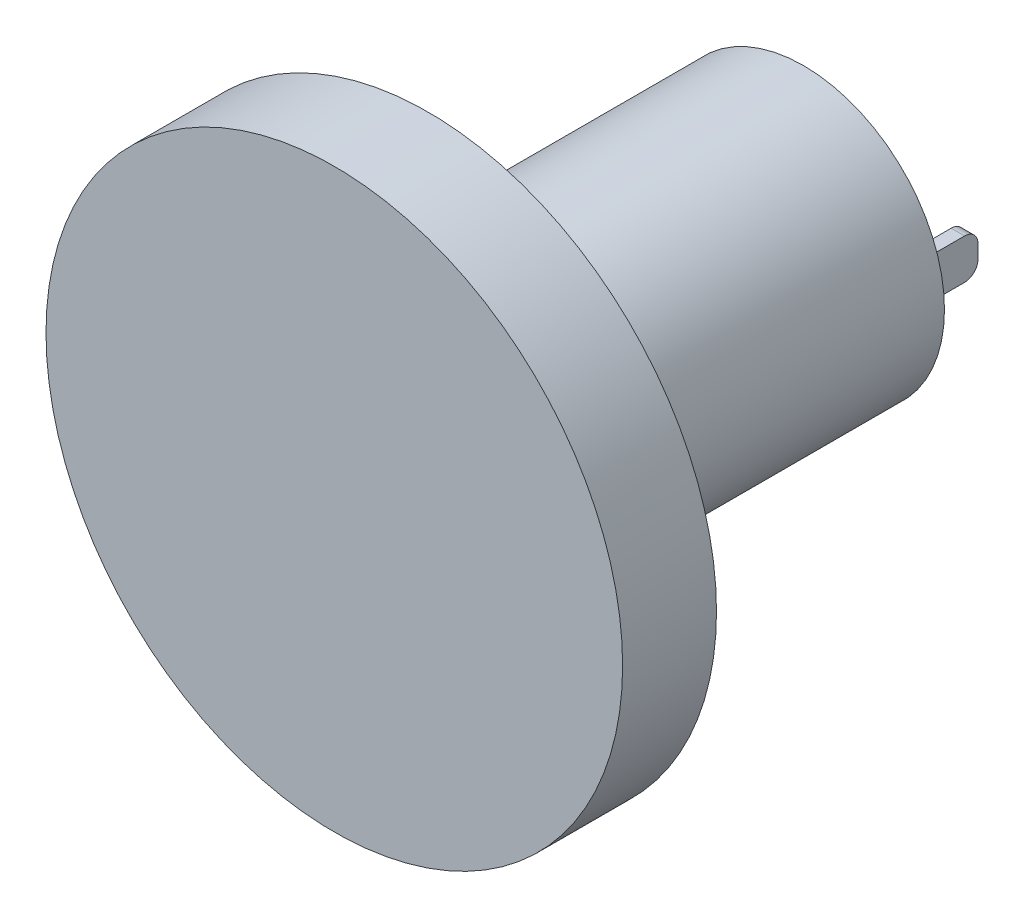
ISO-10303-21;
HEADER;
FILE_DESCRIPTION(('STEP AP214'),'2;1');
FILE_NAME('part.step','',(''),(''),'','','');
FILE_SCHEMA(('AUTOMOTIVE_DESIGN { 1 0 10303 214 1 1 1 1 }'));
ENDSEC;
DATA;
#1=APPLICATION_CONTEXT('core data for automotive mechanical design processes');
#2=APPLICATION_PROTOCOL_DEFINITION('international standard','automotive_design',2000,#1);
#3=PRODUCT_CONTEXT('',#1,'mechanical');
#4=PRODUCT('Part','Part','',(#3));
#5=PRODUCT_RELATED_PRODUCT_CATEGORY('part','',(#4));
#6=PRODUCT_DEFINITION_FORMATION('','',#4);
#7=PRODUCT_DEFINITION_CONTEXT('part definition',#1,'design');
#8=PRODUCT_DEFINITION('design','',#6,#7);
#9=PRODUCT_DEFINITION_SHAPE('','',#8);
#10=(LENGTH_UNIT() NAMED_UNIT(*) SI_UNIT(.MILLI.,.METRE.));
#11=(NAMED_UNIT(*) PLANE_ANGLE_UNIT() SI_UNIT($,.RADIAN.));
#12=(NAMED_UNIT(*) SI_UNIT($,.STERADIAN.) SOLID_ANGLE_UNIT());
#13=UNCERTAINTY_MEASURE_WITH_UNIT(LENGTH_MEASURE(1.E-05),#10,'distance_accuracy_value','');
#14=(GEOMETRIC_REPRESENTATION_CONTEXT(3) GLOBAL_UNCERTAINTY_ASSIGNED_CONTEXT((#13)) GLOBAL_UNIT_ASSIGNED_CONTEXT((#10,
#11,#12)) REPRESENTATION_CONTEXT('',''));
#15=CARTESIAN_POINT('',(0.,0.,0.));
#16=DIRECTION('',(0.,0.,1.));
#17=DIRECTION('',(1.,0.,0.));
#18=AXIS2_PLACEMENT_3D('',#15,#16,#17);
#19=CARTESIAN_POINT('',(-10.7845123488429,4.35461318675267,35.));
#20=DIRECTION('',(0.,0.,-1.));
#21=DIRECTION('',(-1.,0.,0.));
#22=AXIS2_PLACEMENT_3D('',#19,#20,#21);
#23=CYLINDRICAL_SURFACE('',#22,1.);
#24=CARTESIAN_POINT('',(-10.7845123488429,4.35461318675267,27.));
#25=DIRECTION('',(0.,0.,1.));
#26=DIRECTION('',(1.,0.,0.));
#27=AXIS2_PLACEMENT_3D('',#24,#25,#26);
#28=CIRCLE('',#27,1.);
#29=CARTESIAN_POINT('',(-9.78451234884289,4.35461318675267,27.));
#30=VERTEX_POINT('',#29);
#31=EDGE_CURVE('E208',#30,#30,#28,.T.);
#32=ORIENTED_EDGE('',*,*,#31,.T.);
#33=EDGE_LOOP('',(#32));
#34=FACE_BOUND('',#33,.T.);
#35=CARTESIAN_POINT('',(-10.7845123488429,4.35461318675267,28.));
#36=DIRECTION('',(0.,0.,1.));
#37=DIRECTION('',(1.,0.,0.));
#38=AXIS2_PLACEMENT_3D('',#35,#36,#37);
#39=CIRCLE('',#38,1.);
#40=CARTESIAN_POINT('',(-9.78451234884289,4.35461318675267,28.));
#41=VERTEX_POINT('',#40);
#42=EDGE_CURVE('E12',#41,#41,#39,.T.);
#43=ORIENTED_EDGE('',*,*,#42,.F.);
#44=EDGE_LOOP('',(#43));
#45=FACE_BOUND('',#44,.T.);
#46=ADVANCED_FACE('F35',(#34,#45),#23,.T.);
#47=CARTESIAN_POINT('',(-10.7845123488429,4.35461318675267,0.));
#48=DIRECTION('',(0.,0.,1.));
#49=DIRECTION('',(1.,0.,0.));
#50=AXIS2_PLACEMENT_3D('',#47,#48,#49);
#51=PLANE('',#50);
#52=DIRECTION('',(0.,1.,0.));
#53=VECTOR('',#52,1.);
#54=CARTESIAN_POINT('',(-3.78451234884289,5.85461318675267,0.));
#55=LINE('',#54,#53);
#56=CARTESIAN_POINT('',(-3.78451234884289,2.85461318675267,0.));
#57=VERTEX_POINT('',#56);
#58=CARTESIAN_POINT('',(-3.78451234884289,5.85461318675267,0.));
#59=VERTEX_POINT('',#58);
#60=EDGE_CURVE('E152',#57,#59,#55,.T.);
#61=ORIENTED_EDGE('',*,*,#60,.F.);
#62=DIRECTION('',(-1.,0.,0.));
#63=VECTOR('',#62,1.);
#64=CARTESIAN_POINT('',(-3.78451234884289,2.85461318675267,0.));
#65=LINE('',#64,#63);
#66=CARTESIAN_POINT('',(-2.78451234884289,2.85461318675267,0.));
#67=VERTEX_POINT('',#66);
#68=EDGE_CURVE('E164',#67,#57,#65,.T.);
#69=ORIENTED_EDGE('',*,*,#68,.F.);
#70=DIRECTION('',(0.,-1.,0.));
#71=VECTOR('',#70,1.);
#72=CARTESIAN_POINT('',(-2.78451234884289,5.85461318675267,0.));
#73=LINE('',#72,#71);
#74=CARTESIAN_POINT('',(-2.78451234884289,5.85461318675267,0.));
#75=VERTEX_POINT('',#74);
#76=EDGE_CURVE('E170',#75,#67,#73,.T.);
#77=ORIENTED_EDGE('',*,*,#76,.F.);
#78=DIRECTION('',(1.,0.,0.));
#79=VECTOR('',#78,1.);
#80=CARTESIAN_POINT('',(-3.78451234884289,5.85461318675267,0.));
#81=LINE('',#80,#79);
#82=EDGE_CURVE('E155',#59,#75,#81,.T.);
#83=ORIENTED_EDGE('',*,*,#82,.F.);
#84=EDGE_LOOP('',(#61,#69,#77,#83));
#85=FACE_BOUND('',#84,.T.);
#86=CARTESIAN_POINT('',(-10.7845123488429,4.35461318675267,0.));
#87=DIRECTION('',(0.,0.,1.));
#88=DIRECTION('',(1.,0.,0.));
#89=AXIS2_PLACEMENT_3D('',#86,#87,#88);
#90=CIRCLE('',#89,10.5);
#91=CARTESIAN_POINT('',(-21.2845123488429,4.35461318675267,0.));
#92=VERTEX_POINT('',#91);
#93=EDGE_CURVE('E221',#92,#92,#90,.T.);
#94=ORIENTED_EDGE('',*,*,#93,.F.);
#95=EDGE_LOOP('',(#94));
#96=FACE_BOUND('',#95,.T.);
#97=DIRECTION('',(0.,-1.,0.));
#98=VECTOR('',#97,1.);
#99=CARTESIAN_POINT('',(-17.7845123488429,2.85461318675267,0.));
#100=LINE('',#99,#98);
#101=CARTESIAN_POINT('',(-17.7845123488429,5.85461318675267,0.));
#102=VERTEX_POINT('',#101);
#103=CARTESIAN_POINT('',(-17.7845123488429,2.85461318675267,0.));
#104=VERTEX_POINT('',#103);
#105=EDGE_CURVE('E182',#102,#104,#100,.T.);
#106=ORIENTED_EDGE('',*,*,#105,.F.);
#107=DIRECTION('',(1.,0.,0.));
#108=VECTOR('',#107,1.);
#109=CARTESIAN_POINT('',(-17.7845123488429,5.85461318675267,0.));
#110=LINE('',#109,#108);
#111=CARTESIAN_POINT('',(-18.7845123488429,5.85461318675267,0.));
#112=VERTEX_POINT('',#111);
#113=EDGE_CURVE('E187',#112,#102,#110,.T.);
#114=ORIENTED_EDGE('',*,*,#113,.F.);
#115=DIRECTION('',(0.,1.,0.));
#116=VECTOR('',#115,1.);
#117=CARTESIAN_POINT('',(-18.7845123488429,2.85461318675267,0.));
#118=LINE('',#117,#116);
#119=CARTESIAN_POINT('',(-18.7845123488429,2.85461318675267,0.));
#120=VERTEX_POINT('',#119);
#121=EDGE_CURVE('E196',#120,#112,#118,.T.);
#122=ORIENTED_EDGE('',*,*,#121,.F.);
#123=DIRECTION('',(-1.,0.,0.));
#124=VECTOR('',#123,1.);
#125=CARTESIAN_POINT('',(-17.7845123488429,2.85461318675267,0.));
#126=LINE('',#125,#124);
#127=EDGE_CURVE('E193',#104,#120,#126,.T.);
#128=ORIENTED_EDGE('',*,*,#127,.F.);
#129=EDGE_LOOP('',(#106,#114,#122,#128));
#130=FACE_BOUND('',#129,.T.);
#131=CARTESIAN_POINT('',(-10.7845123488429,4.35461318675267,0.));
#132=DIRECTION('',(0.,0.,-1.));
#133=DIRECTION('',(-1.,0.,0.));
#134=AXIS2_PLACEMENT_3D('',#131,#132,#133);
#135=CIRCLE('',#134,3.);
#136=CARTESIAN_POINT('',(-8.78451234884289,6.59068116425246,0.));
#137=VERTEX_POINT('',#136);
#138=CARTESIAN_POINT('',(-12.7845123488429,6.59068116425246,0.));
#139=VERTEX_POINT('',#138);
#140=EDGE_CURVE('E151',#137,#139,#135,.T.);
#141=ORIENTED_EDGE('',*,*,#140,.F.);
#142=DIRECTION('',(1.,0.,0.));
#143=VECTOR('',#142,1.);
#144=CARTESIAN_POINT('',(-8.78451234884289,6.59068116425246,0.));
#145=LINE('',#144,#143);
#146=EDGE_CURVE('E49',#139,#137,#145,.T.);
#147=ORIENTED_EDGE('',*,*,#146,.F.);
#148=EDGE_LOOP('',(#141,#147));
#149=FACE_BOUND('',#148,.T.);
#150=ADVANCED_FACE('F288',(#85,#96,#130,#149),#51,.F.);
#151=CARTESIAN_POINT('',(-10.7845123488429,4.35461318675267,21.));
#152=DIRECTION('',(0.,0.,-1.));
#153=DIRECTION('',(-1.,0.,0.));
#154=AXIS2_PLACEMENT_3D('',#151,#152,#153);
#155=CYLINDRICAL_SURFACE('',#154,10.5);
#156=CARTESIAN_POINT('',(-10.7845123488429,4.35461318675267,21.));
#157=DIRECTION('',(0.,0.,1.));
#158=DIRECTION('',(1.,0.,0.));
#159=AXIS2_PLACEMENT_3D('',#156,#157,#158);
#160=CIRCLE('',#159,10.5);
#161=CARTESIAN_POINT('',(-21.2845123488429,4.35461318675267,21.));
#162=VERTEX_POINT('',#161);
#163=EDGE_CURVE('E224',#162,#162,#160,.T.);
#164=CARTESIAN_POINT('',(-21.2845123488429,4.35461318675267,21.));
#165=CARTESIAN_POINT('',(-21.2845123488429,4.35461318675267,20.78125));
#166=CARTESIAN_POINT('',(-21.2845123488429,4.35461318675267,20.5625));
#167=CARTESIAN_POINT('',(-21.2845123488429,4.35461318675267,20.125));
#168=CARTESIAN_POINT('',(-21.2845123488429,4.35461318675267,19.90625));
#169=CARTESIAN_POINT('',(-21.2845123488429,4.35461318675267,19.46875));
#170=CARTESIAN_POINT('',(-21.2845123488429,4.35461318675267,19.25));
#171=CARTESIAN_POINT('',(-21.2845123488429,4.35461318675267,18.8125));
#172=CARTESIAN_POINT('',(-21.2845123488429,4.35461318675267,18.59375));
#173=CARTESIAN_POINT('',(-21.2845123488429,4.35461318675267,18.15625));
#174=CARTESIAN_POINT('',(-21.2845123488429,4.35461318675267,17.9375));
#175=CARTESIAN_POINT('',(-21.2845123488429,4.35461318675267,17.5));
#176=CARTESIAN_POINT('',(-21.2845123488429,4.35461318675267,17.28125));
#177=CARTESIAN_POINT('',(-21.2845123488429,4.35461318675267,16.84375));
#178=CARTESIAN_POINT('',(-21.2845123488429,4.35461318675267,16.625));
#179=CARTESIAN_POINT('',(-21.2845123488429,4.35461318675267,16.1875));
#180=CARTESIAN_POINT('',(-21.2845123488429,4.35461318675267,15.96875));
#181=CARTESIAN_POINT('',(-21.2845123488429,4.35461318675267,15.53125));
#182=CARTESIAN_POINT('',(-21.2845123488429,4.35461318675267,15.3125));
#183=CARTESIAN_POINT('',(-21.2845123488429,4.35461318675267,14.875));
#184=CARTESIAN_POINT('',(-21.2845123488429,4.35461318675267,14.65625));
#185=CARTESIAN_POINT('',(-21.2845123488429,4.35461318675267,14.21875));
#186=CARTESIAN_POINT('',(-21.2845123488429,4.35461318675267,14.));
#187=CARTESIAN_POINT('',(-21.2845123488429,4.35461318675267,13.5625));
#188=CARTESIAN_POINT('',(-21.2845123488429,4.35461318675267,13.34375));
#189=CARTESIAN_POINT('',(-21.2845123488429,4.35461318675267,12.90625));
#190=CARTESIAN_POINT('',(-21.2845123488429,4.35461318675267,12.6875));
#191=CARTESIAN_POINT('',(-21.2845123488429,4.35461318675267,12.25));
#192=CARTESIAN_POINT('',(-21.2845123488429,4.35461318675267,12.03125));
#193=CARTESIAN_POINT('',(-21.2845123488429,4.35461318675267,11.59375));
#194=CARTESIAN_POINT('',(-21.2845123488429,4.35461318675267,11.375));
#195=CARTESIAN_POINT('',(-21.2845123488429,4.35461318675267,10.9375));
#196=CARTESIAN_POINT('',(-21.2845123488429,4.35461318675267,10.71875));
#197=CARTESIAN_POINT('',(-21.2845123488429,4.35461318675267,10.28125));
#198=CARTESIAN_POINT('',(-21.2845123488429,4.35461318675267,10.0625));
#199=CARTESIAN_POINT('',(-21.2845123488429,4.35461318675267,9.625));
#200=CARTESIAN_POINT('',(-21.2845123488429,4.35461318675267,9.40625));
#201=CARTESIAN_POINT('',(-21.2845123488429,4.35461318675267,8.96875));
#202=CARTESIAN_POINT('',(-21.2845123488429,4.35461318675267,8.75));
#203=CARTESIAN_POINT('',(-21.2845123488429,4.35461318675267,8.3125));
#204=CARTESIAN_POINT('',(-21.2845123488429,4.35461318675267,8.09375));
#205=CARTESIAN_POINT('',(-21.2845123488429,4.35461318675267,7.65625));
#206=CARTESIAN_POINT('',(-21.2845123488429,4.35461318675267,7.4375));
#207=CARTESIAN_POINT('',(-21.2845123488429,4.35461318675267,7.));
#208=CARTESIAN_POINT('',(-21.2845123488429,4.35461318675267,6.78125));
#209=CARTESIAN_POINT('',(-21.2845123488429,4.35461318675267,6.34375));
#210=CARTESIAN_POINT('',(-21.2845123488429,4.35461318675267,6.125));
#211=CARTESIAN_POINT('',(-21.2845123488429,4.35461318675267,5.6875));
#212=CARTESIAN_POINT('',(-21.2845123488429,4.35461318675267,5.46875));
#213=CARTESIAN_POINT('',(-21.2845123488429,4.35461318675267,5.03125));
#214=CARTESIAN_POINT('',(-21.2845123488429,4.35461318675267,4.8125));
#215=CARTESIAN_POINT('',(-21.2845123488429,4.35461318675267,4.375));
#216=CARTESIAN_POINT('',(-21.2845123488429,4.35461318675267,4.15625));
#217=CARTESIAN_POINT('',(-21.2845123488429,4.35461318675267,3.71875));
#218=CARTESIAN_POINT('',(-21.2845123488429,4.35461318675267,3.5));
#219=CARTESIAN_POINT('',(-21.2845123488429,4.35461318675267,3.0625));
#220=CARTESIAN_POINT('',(-21.2845123488429,4.35461318675267,2.84375));
#221=CARTESIAN_POINT('',(-21.2845123488429,4.35461318675267,2.40625));
#222=CARTESIAN_POINT('',(-21.2845123488429,4.35461318675267,2.1875));
#223=CARTESIAN_POINT('',(-21.2845123488429,4.35461318675267,1.75));
#224=CARTESIAN_POINT('',(-21.2845123488429,4.35461318675267,1.53125));
#225=CARTESIAN_POINT('',(-21.2845123488429,4.35461318675267,1.09375));
#226=CARTESIAN_POINT('',(-21.2845123488429,4.35461318675267,0.875000000000001));
#227=CARTESIAN_POINT('',(-21.2845123488429,4.35461318675267,0.4375));
#228=CARTESIAN_POINT('',(-21.2845123488429,4.35461318675267,0.21875));
#229=CARTESIAN_POINT('',(-21.2845123488429,4.35461318675267,0.));
#230=B_SPLINE_CURVE_WITH_KNOTS('',3,(#164,#165,#166,#167,#168,#169,#170,#171,#172,#173,#174,
#175,#176,#177,#178,#179,#180,#181,#182,#183,#184,#185,#186,#187,#188,#189,#190,#191,#192,#193,
#194,#195,#196,#197,#198,#199,#200,#201,#202,#203,#204,#205,#206,#207,#208,#209,#210,#211,#212,
#213,#214,#215,#216,#217,#218,#219,#220,#221,#222,#223,#224,#225,#226,#227,#228,#229),
.UNSPECIFIED.,.F.,.F.,(4,2,2,2,2,2,2,2,2,2,2,2,2,2,2,2,2,2,2,2,2,2,2,2,2,2,2,2,2,2,2,2,4),(0.,
0.656250000000001,1.3125,1.96875,2.625,3.28125,3.9375,4.59375,5.25,5.90625,6.5625,7.21875,7.875,
8.53125,9.1875,9.84375,10.5,11.15625,11.8125,12.46875,13.125,13.78125,14.4375,15.09375,15.75,
16.40625,17.0625,17.71875,18.375,19.03125,19.6875,20.34375,21.),.UNSPECIFIED.);
#231=EDGE_CURVE('BSEAM291',#162,#92,#230,.T.);
#232=ORIENTED_EDGE('',*,*,#163,.F.);
#233=ORIENTED_EDGE('',*,*,#93,.T.);
#234=ORIENTED_EDGE('',*,*,#231,.T.);
#235=ORIENTED_EDGE('',*,*,#231,.F.);
#236=EDGE_LOOP('',(#232,#234,#233,#235));
#237=FACE_BOUND('',#236,.T.);
#238=ADVANCED_FACE('F291',(#237),#155,.T.);
#239=CARTESIAN_POINT('',(-10.7845123488429,4.35461318675267,21.));
#240=DIRECTION('',(0.,0.,1.));
#241=DIRECTION('',(1.,0.,0.));
#242=AXIS2_PLACEMENT_3D('',#239,#240,#241);
#243=PLANE('',#242);
#244=CARTESIAN_POINT('',(-10.7845123488429,4.35461318675267,21.));
#245=DIRECTION('',(0.,0.,1.));
#246=DIRECTION('',(1.,0.,0.));
#247=AXIS2_PLACEMENT_3D('',#244,#245,#246);
#248=CIRCLE('',#247,8.5);
#249=CARTESIAN_POINT('',(-2.28451234884289,4.35461318675267,21.));
#250=VERTEX_POINT('',#249);
#251=EDGE_CURVE('E215',#250,#250,#248,.T.);
#252=ORIENTED_EDGE('',*,*,#251,.F.);
#253=EDGE_LOOP('',(#252));
#254=FACE_BOUND('',#253,.T.);
#255=ORIENTED_EDGE('',*,*,#163,.T.);
#256=EDGE_LOOP('',(#255));
#257=FACE_BOUND('',#256,.T.);
#258=ADVANCED_FACE('F355',(#254,#257),#243,.T.);
#259=CARTESIAN_POINT('',(-10.7845123488429,4.35461318675267,25.));
#260=DIRECTION('',(0.,0.,-1.));
#261=DIRECTION('',(-1.,0.,0.));
#262=AXIS2_PLACEMENT_3D('',#259,#260,#261);
#263=CYLINDRICAL_SURFACE('',#262,8.5);
#264=CARTESIAN_POINT('',(-10.7845123488429,4.35461318675267,25.));
#265=DIRECTION('',(0.,0.,1.));
#266=DIRECTION('',(1.,0.,0.));
#267=AXIS2_PLACEMENT_3D('',#264,#265,#266);
#268=CIRCLE('',#267,8.5);
#269=CARTESIAN_POINT('',(-2.28451234884289,4.35461318675267,25.));
#270=VERTEX_POINT('',#269);
#271=EDGE_CURVE('E218',#270,#270,#268,.T.);
#272=ORIENTED_EDGE('',*,*,#271,.F.);
#273=EDGE_LOOP('',(#272));
#274=FACE_BOUND('',#273,.T.);
#275=ORIENTED_EDGE('',*,*,#251,.T.);
#276=EDGE_LOOP('',(#275));
#277=FACE_BOUND('',#276,.T.);
#278=ADVANCED_FACE('F351',(#274,#277),#263,.T.);
#279=CARTESIAN_POINT('',(-10.7845123488429,4.35461318675267,25.));
#280=DIRECTION('',(0.,0.,1.));
#281=DIRECTION('',(1.,0.,0.));
#282=AXIS2_PLACEMENT_3D('',#279,#280,#281);
#283=PLANE('',#282);
#284=CARTESIAN_POINT('',(-10.7845123488429,4.35461318675267,25.));
#285=DIRECTION('',(0.,0.,1.));
#286=DIRECTION('',(1.,0.,0.));
#287=AXIS2_PLACEMENT_3D('',#284,#285,#286);
#288=CIRCLE('',#287,3.);
#289=CARTESIAN_POINT('',(-7.78451234884289,4.35461318675267,25.));
#290=VERTEX_POINT('',#289);
#291=EDGE_CURVE('E211',#290,#290,#288,.T.);
#292=ORIENTED_EDGE('',*,*,#291,.F.);
#293=EDGE_LOOP('',(#292));
#294=FACE_BOUND('',#293,.T.);
#295=ORIENTED_EDGE('',*,*,#271,.T.);
#296=EDGE_LOOP('',(#295));
#297=FACE_BOUND('',#296,.T.);
#298=ADVANCED_FACE('F347',(#294,#297),#283,.T.);
#299=CARTESIAN_POINT('',(-10.7845123488429,4.35461318675267,27.));
#300=DIRECTION('',(0.,0.,-1.));
#301=DIRECTION('',(-1.,0.,0.));
#302=AXIS2_PLACEMENT_3D('',#299,#300,#301);
#303=CYLINDRICAL_SURFACE('',#302,3.);
#304=CARTESIAN_POINT('',(-10.7845123488429,4.35461318675267,27.));
#305=DIRECTION('',(0.,0.,1.));
#306=DIRECTION('',(1.,0.,0.));
#307=AXIS2_PLACEMENT_3D('',#304,#305,#306);
#308=CIRCLE('',#307,3.);
#309=CARTESIAN_POINT('',(-7.78451234884289,4.35461318675267,27.));
#310=VERTEX_POINT('',#309);
#311=EDGE_CURVE('E212',#310,#310,#308,.T.);
#312=ORIENTED_EDGE('',*,*,#311,.F.);
#313=EDGE_LOOP('',(#312));
#314=FACE_BOUND('',#313,.T.);
#315=ORIENTED_EDGE('',*,*,#291,.T.);
#316=EDGE_LOOP('',(#315));
#317=FACE_BOUND('',#316,.T.);
#318=ADVANCED_FACE('F343',(#314,#317),#303,.T.);
#319=CARTESIAN_POINT('',(-10.7845123488429,4.35461318675267,27.));
#320=DIRECTION('',(0.,0.,1.));
#321=DIRECTION('',(1.,0.,0.));
#322=AXIS2_PLACEMENT_3D('',#319,#320,#321);
#323=PLANE('',#322);
#324=ORIENTED_EDGE('',*,*,#31,.F.);
#325=EDGE_LOOP('',(#324));
#326=FACE_BOUND('',#325,.T.);
#327=ORIENTED_EDGE('',*,*,#311,.T.);
#328=EDGE_LOOP('',(#327));
#329=FACE_BOUND('',#328,.T.);
#330=ADVANCED_FACE('F339',(#326,#329),#323,.T.);
#331=CARTESIAN_POINT('',(-17.7845123488429,2.85461318675267,-5.));
#332=DIRECTION('',(-1.,0.,0.));
#333=DIRECTION('',(0.,0.,1.));
#334=AXIS2_PLACEMENT_3D('',#331,#332,#333);
#335=PLANE('',#334);
#336=DIRECTION('',(0.,0.,1.));
#337=VECTOR('',#336,1.);
#338=CARTESIAN_POINT('',(-17.7845123488429,2.85461318675267,-5.));
#339=LINE('',#338,#337);
#340=CARTESIAN_POINT('',(-17.7845123488429,2.85461318675267,-4.));
#341=VERTEX_POINT('',#340);
#342=EDGE_CURVE('E206',#341,#104,#339,.T.);
#343=ORIENTED_EDGE('',*,*,#342,.F.);
#344=CARTESIAN_POINT('',(-17.7845123488429,3.85461318675267,-4.));
#345=DIRECTION('',(-1.,0.,0.));
#346=DIRECTION('',(0.,0.,1.));
#347=AXIS2_PLACEMENT_3D('',#344,#345,#346);
#348=CIRCLE('',#347,1.);
#349=CARTESIAN_POINT('',(-17.7845123488429,3.85461318675267,-5.));
#350=VERTEX_POINT('',#349);
#351=EDGE_CURVE('E243',#341,#350,#348,.F.);
#352=ORIENTED_EDGE('',*,*,#351,.T.);
#353=DIRECTION('',(0.,-1.,0.));
#354=VECTOR('',#353,1.);
#355=CARTESIAN_POINT('',(-17.7845123488429,2.85461318675267,-5.));
#356=LINE('',#355,#354);
#357=CARTESIAN_POINT('',(-17.7845123488429,4.85461318675267,-5.));
#358=VERTEX_POINT('',#357);
#359=EDGE_CURVE('E183',#358,#350,#356,.T.);
#360=ORIENTED_EDGE('',*,*,#359,.F.);
#361=CARTESIAN_POINT('',(-17.7845123488429,4.85461318675267,-4.));
#362=DIRECTION('',(-1.,0.,0.));
#363=DIRECTION('',(0.,0.,1.));
#364=AXIS2_PLACEMENT_3D('',#361,#362,#363);
#365=CIRCLE('',#364,1.);
#366=CARTESIAN_POINT('',(-17.7845123488429,5.85461318675267,-4.));
#367=VERTEX_POINT('',#366);
#368=EDGE_CURVE('E241',#358,#367,#365,.F.);
#369=ORIENTED_EDGE('',*,*,#368,.T.);
#370=DIRECTION('',(0.,0.,1.));
#371=VECTOR('',#370,1.);
#372=CARTESIAN_POINT('',(-17.7845123488429,5.85461318675267,-5.));
#373=LINE('',#372,#371);
#374=EDGE_CURVE('E190',#367,#102,#373,.T.);
#375=ORIENTED_EDGE('',*,*,#374,.T.);
#376=ORIENTED_EDGE('',*,*,#105,.T.);
#377=EDGE_LOOP('',(#343,#352,#360,#369,#375,#376));
#378=FACE_BOUND('',#377,.T.);
#379=ADVANCED_FACE('F342',(#378),#335,.F.);
#380=CARTESIAN_POINT('',(-17.7845123488429,2.85461318675267,-5.));
#381=DIRECTION('',(0.,1.,0.));
#382=DIRECTION('',(0.,0.,1.));
#383=AXIS2_PLACEMENT_3D('',#380,#381,#382);
#384=PLANE('',#383);
#385=DIRECTION('',(0.,0.,1.));
#386=VECTOR('',#385,1.);
#387=CARTESIAN_POINT('',(-18.7845123488429,2.85461318675267,-5.));
#388=LINE('',#387,#386);
#389=CARTESIAN_POINT('',(-18.7845123488429,2.85461318675267,-4.));
#390=VERTEX_POINT('',#389);
#391=EDGE_CURVE('E204',#390,#120,#388,.T.);
#392=ORIENTED_EDGE('',*,*,#391,.F.);
#393=DIRECTION('',(-1.,0.,0.));
#394=VECTOR('',#393,1.);
#395=CARTESIAN_POINT('',(-17.7845123488429,2.85461318675267,-4.));
#396=LINE('',#395,#394);
#397=EDGE_CURVE('E239',#390,#341,#396,.F.);
#398=ORIENTED_EDGE('',*,*,#397,.T.);
#399=ORIENTED_EDGE('',*,*,#342,.T.);
#400=ORIENTED_EDGE('',*,*,#127,.T.);
#401=EDGE_LOOP('',(#392,#398,#399,#400));
#402=FACE_BOUND('',#401,.T.);
#403=ADVANCED_FACE('F405',(#402),#384,.F.);
#404=CARTESIAN_POINT('',(-18.7845123488429,2.85461318675267,-5.));
#405=DIRECTION('',(1.,0.,0.));
#406=DIRECTION('',(0.,0.,-1.));
#407=AXIS2_PLACEMENT_3D('',#404,#405,#406);
#408=PLANE('',#407);
#409=DIRECTION('',(0.,1.,0.));
#410=VECTOR('',#409,1.);
#411=CARTESIAN_POINT('',(-18.7845123488429,2.85461318675267,-5.));
#412=LINE('',#411,#410);
#413=CARTESIAN_POINT('',(-18.7845123488429,3.85461318675267,-5.));
#414=VERTEX_POINT('',#413);
#415=CARTESIAN_POINT('',(-18.7845123488429,4.85461318675267,-5.));
#416=VERTEX_POINT('',#415);
#417=EDGE_CURVE('E186',#414,#416,#412,.T.);
#418=ORIENTED_EDGE('',*,*,#417,.F.);
#419=CARTESIAN_POINT('',(-18.7845123488429,3.85461318675267,-4.));
#420=DIRECTION('',(1.,0.,0.));
#421=DIRECTION('',(0.,0.,-1.));
#422=AXIS2_PLACEMENT_3D('',#419,#420,#421);
#423=CIRCLE('',#422,1.);
#424=EDGE_CURVE('E237',#414,#390,#423,.F.);
#425=ORIENTED_EDGE('',*,*,#424,.T.);
#426=ORIENTED_EDGE('',*,*,#391,.T.);
#427=ORIENTED_EDGE('',*,*,#121,.T.);
#428=DIRECTION('',(0.,0.,1.));
#429=VECTOR('',#428,1.);
#430=CARTESIAN_POINT('',(-18.7845123488429,5.85461318675267,-5.));
#431=LINE('',#430,#429);
#432=CARTESIAN_POINT('',(-18.7845123488429,5.85461318675267,-4.));
#433=VERTEX_POINT('',#432);
#434=EDGE_CURVE('E202',#433,#112,#431,.T.);
#435=ORIENTED_EDGE('',*,*,#434,.F.);
#436=CARTESIAN_POINT('',(-18.7845123488429,4.85461318675267,-4.));
#437=DIRECTION('',(1.,0.,0.));
#438=DIRECTION('',(0.,0.,-1.));
#439=AXIS2_PLACEMENT_3D('',#436,#437,#438);
#440=CIRCLE('',#439,1.);
#441=EDGE_CURVE('E235',#433,#416,#440,.F.);
#442=ORIENTED_EDGE('',*,*,#441,.T.);
#443=EDGE_LOOP('',(#418,#425,#426,#427,#435,#442));
#444=FACE_BOUND('',#443,.T.);
#445=ADVANCED_FACE('F401',(#444),#408,.F.);
#446=CARTESIAN_POINT('',(-17.7845123488429,5.85461318675267,-5.));
#447=DIRECTION('',(0.,-1.,0.));
#448=DIRECTION('',(1.,0.,0.));
#449=AXIS2_PLACEMENT_3D('',#446,#447,#448);
#450=PLANE('',#449);
#451=ORIENTED_EDGE('',*,*,#374,.F.);
#452=DIRECTION('',(1.,0.,0.));
#453=VECTOR('',#452,1.);
#454=CARTESIAN_POINT('',(-17.7845123488429,5.85461318675267,-4.));
#455=LINE('',#454,#453);
#456=EDGE_CURVE('E245',#367,#433,#455,.F.);
#457=ORIENTED_EDGE('',*,*,#456,.T.);
#458=ORIENTED_EDGE('',*,*,#434,.T.);
#459=ORIENTED_EDGE('',*,*,#113,.T.);
#460=EDGE_LOOP('',(#451,#457,#458,#459));
#461=FACE_BOUND('',#460,.T.);
#462=ADVANCED_FACE('F397',(#461),#450,.F.);
#463=CARTESIAN_POINT('',(0.,0.,-5.));
#464=DIRECTION('',(0.,0.,1.));
#465=DIRECTION('',(1.,0.,0.));
#466=AXIS2_PLACEMENT_3D('',#463,#464,#465);
#467=PLANE('',#466);
#468=ORIENTED_EDGE('',*,*,#359,.T.);
#469=DIRECTION('',(-1.,0.,0.));
#470=VECTOR('',#469,1.);
#471=CARTESIAN_POINT('',(0.,3.85461318675267,-5.));
#472=LINE('',#471,#470);
#473=EDGE_CURVE('E232',#350,#414,#472,.T.);
#474=ORIENTED_EDGE('',*,*,#473,.T.);
#475=ORIENTED_EDGE('',*,*,#417,.T.);
#476=DIRECTION('',(1.,0.,0.));
#477=VECTOR('',#476,1.);
#478=CARTESIAN_POINT('',(0.,4.85461318675269,-5.));
#479=LINE('',#478,#477);
#480=EDGE_CURVE('E227',#416,#358,#479,.T.);
#481=ORIENTED_EDGE('',*,*,#480,.T.);
#482=EDGE_LOOP('',(#468,#474,#475,#481));
#483=FACE_BOUND('',#482,.T.);
#484=ADVANCED_FACE('F394',(#483),#467,.F.);
#485=CARTESIAN_POINT('',(-3.78451234884289,5.85461318675267,-5.));
#486=DIRECTION('',(1.,0.,0.));
#487=DIRECTION('',(0.,1.,0.));
#488=AXIS2_PLACEMENT_3D('',#485,#486,#487);
#489=PLANE('',#488);
#490=DIRECTION('',(0.,1.,0.));
#491=VECTOR('',#490,1.);
#492=CARTESIAN_POINT('',(-3.78451234884289,5.85461318675267,-5.));
#493=LINE('',#492,#491);
#494=CARTESIAN_POINT('',(-3.78451234884289,3.85461318675267,-5.));
#495=VERTEX_POINT('',#494);
#496=CARTESIAN_POINT('',(-3.78451234884289,4.85461318675267,-5.));
#497=VERTEX_POINT('',#496);
#498=EDGE_CURVE('E160',#495,#497,#493,.T.);
#499=ORIENTED_EDGE('',*,*,#498,.F.);
#500=CARTESIAN_POINT('',(-3.78451234884289,3.85461318675267,-4.));
#501=DIRECTION('',(1.,0.,0.));
#502=DIRECTION('',(0.,1.,0.));
#503=AXIS2_PLACEMENT_3D('',#500,#501,#502);
#504=CIRCLE('',#503,1.);
#505=CARTESIAN_POINT('',(-3.78451234884289,2.85461318675267,-4.));
#506=VERTEX_POINT('',#505);
#507=EDGE_CURVE('E255',#495,#506,#504,.F.);
#508=ORIENTED_EDGE('',*,*,#507,.T.);
#509=DIRECTION('',(0.,0.,1.));
#510=VECTOR('',#509,1.);
#511=CARTESIAN_POINT('',(-3.78451234884289,2.85461318675267,-5.));
#512=LINE('',#511,#510);
#513=EDGE_CURVE('E166',#506,#57,#512,.T.);
#514=ORIENTED_EDGE('',*,*,#513,.T.);
#515=ORIENTED_EDGE('',*,*,#60,.T.);
#516=DIRECTION('',(0.,0.,1.));
#517=VECTOR('',#516,1.);
#518=CARTESIAN_POINT('',(-3.78451234884289,5.85461318675267,-5.));
#519=LINE('',#518,#517);
#520=CARTESIAN_POINT('',(-3.78451234884289,5.85461318675267,-4.));
#521=VERTEX_POINT('',#520);
#522=EDGE_CURVE('E180',#521,#59,#519,.T.);
#523=ORIENTED_EDGE('',*,*,#522,.F.);
#524=CARTESIAN_POINT('',(-3.78451234884289,4.85461318675267,-4.));
#525=DIRECTION('',(1.,0.,0.));
#526=DIRECTION('',(0.,1.,0.));
#527=AXIS2_PLACEMENT_3D('',#524,#525,#526);
#528=CIRCLE('',#527,1.);
#529=EDGE_CURVE('E253',#521,#497,#528,.F.);
#530=ORIENTED_EDGE('',*,*,#529,.T.);
#531=EDGE_LOOP('',(#499,#508,#514,#515,#523,#530));
#532=FACE_BOUND('',#531,.T.);
#533=ADVANCED_FACE('F270',(#532),#489,.F.);
#534=CARTESIAN_POINT('',(-3.78451234884289,5.85461318675267,-5.));
#535=DIRECTION('',(0.,-1.,0.));
#536=DIRECTION('',(1.,0.,0.));
#537=AXIS2_PLACEMENT_3D('',#534,#535,#536);
#538=PLANE('',#537);
#539=DIRECTION('',(0.,0.,1.));
#540=VECTOR('',#539,1.);
#541=CARTESIAN_POINT('',(-2.78451234884289,5.85461318675267,-5.));
#542=LINE('',#541,#540);
#543=CARTESIAN_POINT('',(-2.78451234884289,5.85461318675267,-4.));
#544=VERTEX_POINT('',#543);
#545=EDGE_CURVE('E178',#544,#75,#542,.T.);
#546=ORIENTED_EDGE('',*,*,#545,.F.);
#547=DIRECTION('',(1.,0.,0.));
#548=VECTOR('',#547,1.);
#549=CARTESIAN_POINT('',(-3.78451234884289,5.85461318675267,-4.));
#550=LINE('',#549,#548);
#551=EDGE_CURVE('E43',#544,#521,#550,.F.);
#552=ORIENTED_EDGE('',*,*,#551,.T.);
#553=ORIENTED_EDGE('',*,*,#522,.T.);
#554=ORIENTED_EDGE('',*,*,#82,.T.);
#555=EDGE_LOOP('',(#546,#552,#553,#554));
#556=FACE_BOUND('',#555,.T.);
#557=ADVANCED_FACE('F264',(#556),#538,.F.);
#558=CARTESIAN_POINT('',(-2.78451234884289,5.85461318675267,-5.));
#559=DIRECTION('',(-1.,0.,0.));
#560=DIRECTION('',(0.,0.,1.));
#561=AXIS2_PLACEMENT_3D('',#558,#559,#560);
#562=PLANE('',#561);
#563=DIRECTION('',(0.,0.,1.));
#564=VECTOR('',#563,1.);
#565=CARTESIAN_POINT('',(-2.78451234884289,2.85461318675267,-5.));
#566=LINE('',#565,#564);
#567=CARTESIAN_POINT('',(-2.78451234884289,2.85461318675267,-4.));
#568=VERTEX_POINT('',#567);
#569=EDGE_CURVE('E176',#568,#67,#566,.T.);
#570=ORIENTED_EDGE('',*,*,#569,.F.);
#571=CARTESIAN_POINT('',(-2.78451234884289,3.85461318675267,-4.));
#572=DIRECTION('',(-1.,0.,0.));
#573=DIRECTION('',(0.,0.,1.));
#574=AXIS2_PLACEMENT_3D('',#571,#572,#573);
#575=CIRCLE('',#574,1.);
#576=CARTESIAN_POINT('',(-2.78451234884289,3.85461318675267,-5.));
#577=VERTEX_POINT('',#576);
#578=EDGE_CURVE('E260',#568,#577,#575,.F.);
#579=ORIENTED_EDGE('',*,*,#578,.T.);
#580=DIRECTION('',(0.,-1.,0.));
#581=VECTOR('',#580,1.);
#582=CARTESIAN_POINT('',(-2.78451234884289,5.85461318675267,-5.));
#583=LINE('',#582,#581);
#584=CARTESIAN_POINT('',(-2.78451234884289,4.85461318675267,-5.));
#585=VERTEX_POINT('',#584);
#586=EDGE_CURVE('E163',#585,#577,#583,.T.);
#587=ORIENTED_EDGE('',*,*,#586,.F.);
#588=CARTESIAN_POINT('',(-2.78451234884289,4.85461318675267,-4.));
#589=DIRECTION('',(-1.,0.,0.));
#590=DIRECTION('',(0.,0.,1.));
#591=AXIS2_PLACEMENT_3D('',#588,#589,#590);
#592=CIRCLE('',#591,1.);
#593=EDGE_CURVE('E57',#585,#544,#592,.F.);
#594=ORIENTED_EDGE('',*,*,#593,.T.);
#595=ORIENTED_EDGE('',*,*,#545,.T.);
#596=ORIENTED_EDGE('',*,*,#76,.T.);
#597=EDGE_LOOP('',(#570,#579,#587,#594,#595,#596));
#598=FACE_BOUND('',#597,.T.);
#599=ADVANCED_FACE('F277',(#598),#562,.F.);
#600=CARTESIAN_POINT('',(-3.78451234884289,2.85461318675267,-5.));
#601=DIRECTION('',(0.,1.,0.));
#602=DIRECTION('',(0.,0.,1.));
#603=AXIS2_PLACEMENT_3D('',#600,#601,#602);
#604=PLANE('',#603);
#605=ORIENTED_EDGE('',*,*,#513,.F.);
#606=DIRECTION('',(-1.,0.,0.));
#607=VECTOR('',#606,1.);
#608=CARTESIAN_POINT('',(-3.78451234884289,2.85461318675267,-4.));
#609=LINE('',#608,#607);
#610=EDGE_CURVE('E257',#506,#568,#609,.F.);
#611=ORIENTED_EDGE('',*,*,#610,.T.);
#612=ORIENTED_EDGE('',*,*,#569,.T.);
#613=ORIENTED_EDGE('',*,*,#68,.T.);
#614=EDGE_LOOP('',(#605,#611,#612,#613));
#615=FACE_BOUND('',#614,.T.);
#616=ADVANCED_FACE('F284',(#615),#604,.F.);
#617=CARTESIAN_POINT('',(0.,0.,-5.));
#618=DIRECTION('',(0.,0.,1.));
#619=DIRECTION('',(1.,0.,0.));
#620=AXIS2_PLACEMENT_3D('',#617,#618,#619);
#621=PLANE('',#620);
#622=ORIENTED_EDGE('',*,*,#586,.T.);
#623=DIRECTION('',(-1.,0.,0.));
#624=VECTOR('',#623,1.);
#625=CARTESIAN_POINT('',(0.,3.85461318675267,-5.));
#626=LINE('',#625,#624);
#627=EDGE_CURVE('E250',#577,#495,#626,.T.);
#628=ORIENTED_EDGE('',*,*,#627,.T.);
#629=ORIENTED_EDGE('',*,*,#498,.T.);
#630=DIRECTION('',(1.,0.,0.));
#631=VECTOR('',#630,1.);
#632=CARTESIAN_POINT('',(0.,4.85461318675267,-5.));
#633=LINE('',#632,#631);
#634=EDGE_CURVE('E247',#497,#585,#633,.T.);
#635=ORIENTED_EDGE('',*,*,#634,.T.);
#636=EDGE_LOOP('',(#622,#628,#629,#635));
#637=FACE_BOUND('',#636,.T.);
#638=ADVANCED_FACE('F274',(#637),#621,.F.);
#639=CARTESIAN_POINT('',(0.,3.85461318675267,-4.));
#640=DIRECTION('',(-1.,0.,0.));
#641=DIRECTION('',(0.,0.,1.));
#642=AXIS2_PLACEMENT_3D('',#639,#640,#641);
#643=CYLINDRICAL_SURFACE('',#642,1.);
#644=ORIENTED_EDGE('',*,*,#351,.F.);
#645=ORIENTED_EDGE('',*,*,#397,.F.);
#646=ORIENTED_EDGE('',*,*,#424,.F.);
#647=ORIENTED_EDGE('',*,*,#473,.F.);
#648=EDGE_LOOP('',(#644,#645,#646,#647));
#649=FACE_BOUND('',#648,.T.);
#650=ADVANCED_FACE('F363',(#649),#643,.T.);
#651=CARTESIAN_POINT('',(0.,4.85461318675269,-4.));
#652=DIRECTION('',(1.,0.,0.));
#653=DIRECTION('',(0.,1.,0.));
#654=AXIS2_PLACEMENT_3D('',#651,#652,#653);
#655=CYLINDRICAL_SURFACE('',#654,1.);
#656=ORIENTED_EDGE('',*,*,#441,.F.);
#657=ORIENTED_EDGE('',*,*,#456,.F.);
#658=ORIENTED_EDGE('',*,*,#368,.F.);
#659=ORIENTED_EDGE('',*,*,#480,.F.);
#660=EDGE_LOOP('',(#656,#657,#658,#659));
#661=FACE_BOUND('',#660,.T.);
#662=ADVANCED_FACE('F366',(#661),#655,.T.);
#663=CARTESIAN_POINT('',(0.,3.85461318675267,-4.));
#664=DIRECTION('',(-1.,0.,0.));
#665=DIRECTION('',(0.,0.,1.));
#666=AXIS2_PLACEMENT_3D('',#663,#664,#665);
#667=CYLINDRICAL_SURFACE('',#666,1.);
#668=ORIENTED_EDGE('',*,*,#578,.F.);
#669=ORIENTED_EDGE('',*,*,#610,.F.);
#670=ORIENTED_EDGE('',*,*,#507,.F.);
#671=ORIENTED_EDGE('',*,*,#627,.F.);
#672=EDGE_LOOP('',(#668,#669,#670,#671));
#673=FACE_BOUND('',#672,.T.);
#674=ADVANCED_FACE('F281',(#673),#667,.T.);
#675=CARTESIAN_POINT('',(0.,4.85461318675267,-4.));
#676=DIRECTION('',(1.,0.,0.));
#677=DIRECTION('',(0.,1.,0.));
#678=AXIS2_PLACEMENT_3D('',#675,#676,#677);
#679=CYLINDRICAL_SURFACE('',#678,1.);
#680=ORIENTED_EDGE('',*,*,#529,.F.);
#681=ORIENTED_EDGE('',*,*,#551,.F.);
#682=ORIENTED_EDGE('',*,*,#593,.F.);
#683=ORIENTED_EDGE('',*,*,#634,.F.);
#684=EDGE_LOOP('',(#680,#681,#682,#683));
#685=FACE_BOUND('',#684,.T.);
#686=ADVANCED_FACE('F37',(#685),#679,.T.);
#687=CARTESIAN_POINT('',(-10.7845123488429,4.35461318675267,-3.));
#688=DIRECTION('',(0.,0.,1.));
#689=DIRECTION('',(1.,0.,0.));
#690=AXIS2_PLACEMENT_3D('',#687,#688,#689);
#691=CYLINDRICAL_SURFACE('',#690,3.);
#692=ORIENTED_EDGE('',*,*,#140,.T.);
#693=DIRECTION('',(0.,0.,1.));
#694=VECTOR('',#693,1.);
#695=CARTESIAN_POINT('',(-12.7845123488429,6.59068116425246,-3.));
#696=LINE('',#695,#694);
#697=CARTESIAN_POINT('',(-12.7845123488429,6.59068116425246,-3.));
#698=VERTEX_POINT('',#697);
#699=EDGE_CURVE('E139',#698,#139,#696,.T.);
#700=ORIENTED_EDGE('',*,*,#699,.F.);
#701=CARTESIAN_POINT('',(-10.7845123488429,4.35461318675267,-3.));
#702=DIRECTION('',(0.,0.,-1.));
#703=DIRECTION('',(-1.,0.,0.));
#704=AXIS2_PLACEMENT_3D('',#701,#702,#703);
#705=CIRCLE('',#704,3.);
#706=CARTESIAN_POINT('',(-8.78451234884289,6.59068116425246,-3.));
#707=VERTEX_POINT('',#706);
#708=EDGE_CURVE('E145',#707,#698,#705,.T.);
#709=ORIENTED_EDGE('',*,*,#708,.F.);
#710=DIRECTION('',(0.,0.,1.));
#711=VECTOR('',#710,1.);
#712=CARTESIAN_POINT('',(-8.78451234884289,6.59068116425246,-3.));
#713=LINE('',#712,#711);
#714=EDGE_CURVE('E142',#707,#137,#713,.T.);
#715=ORIENTED_EDGE('',*,*,#714,.T.);
#716=EDGE_LOOP('',(#692,#700,#709,#715));
#717=FACE_BOUND('',#716,.T.);
#718=ADVANCED_FACE('F150',(#717),#691,.T.);
#719=CARTESIAN_POINT('',(-8.78451234884289,6.59068116425246,-3.));
#720=DIRECTION('',(0.,-1.,0.));
#721=DIRECTION('',(0.,0.,-1.));
#722=AXIS2_PLACEMENT_3D('',#719,#720,#721);
#723=PLANE('',#722);
#724=ORIENTED_EDGE('',*,*,#146,.T.);
#725=ORIENTED_EDGE('',*,*,#714,.F.);
#726=DIRECTION('',(1.,0.,0.));
#727=VECTOR('',#726,1.);
#728=CARTESIAN_POINT('',(-8.78451234884289,6.59068116425246,-3.));
#729=LINE('',#728,#727);
#730=EDGE_CURVE('E135',#698,#707,#729,.T.);
#731=ORIENTED_EDGE('',*,*,#730,.F.);
#732=ORIENTED_EDGE('',*,*,#699,.T.);
#733=EDGE_LOOP('',(#724,#725,#731,#732));
#734=FACE_BOUND('',#733,.T.);
#735=ADVANCED_FACE('F137',(#734),#723,.F.);
#736=CARTESIAN_POINT('',(-10.7845123488429,4.35461318675267,-3.));
#737=DIRECTION('',(0.,0.,-1.));
#738=DIRECTION('',(-1.,0.,0.));
#739=AXIS2_PLACEMENT_3D('',#736,#737,#738);
#740=PLANE('',#739);
#741=CARTESIAN_POINT('',(-10.7845123488429,4.35461318675267,-3.));
#742=DIRECTION('',(0.,0.,-1.));
#743=DIRECTION('',(-1.,0.,0.));
#744=AXIS2_PLACEMENT_3D('',#741,#742,#743);
#745=CIRCLE('',#744,1.);
#746=CARTESIAN_POINT('',(-11.7845123488429,4.35461318675267,-3.));
#747=VERTEX_POINT('',#746);
#748=EDGE_CURVE('E301',#747,#747,#745,.T.);
#749=ORIENTED_EDGE('',*,*,#748,.F.);
#750=EDGE_LOOP('',(#749));
#751=FACE_BOUND('',#750,.T.);
#752=ORIENTED_EDGE('',*,*,#708,.T.);
#753=ORIENTED_EDGE('',*,*,#730,.T.);
#754=EDGE_LOOP('',(#752,#753));
#755=FACE_BOUND('',#754,.T.);
#756=ADVANCED_FACE('F147',(#751,#755),#740,.T.);
#757=CARTESIAN_POINT('',(-10.7845123488429,4.35461318675267,-4.));
#758=DIRECTION('',(0.,0.,1.));
#759=DIRECTION('',(1.,0.,0.));
#760=AXIS2_PLACEMENT_3D('',#757,#758,#759);
#761=CYLINDRICAL_SURFACE('',#760,1.);
#762=CARTESIAN_POINT('',(-10.7845123488429,4.35461318675267,-4.));
#763=DIRECTION('',(0.,0.,-1.));
#764=DIRECTION('',(-1.,0.,0.));
#765=AXIS2_PLACEMENT_3D('',#762,#763,#764);
#766=CIRCLE('',#765,1.);
#767=CARTESIAN_POINT('',(-11.7845123488429,4.35461318675267,-4.));
#768=VERTEX_POINT('',#767);
#769=EDGE_CURVE('E298',#768,#768,#766,.T.);
#770=ORIENTED_EDGE('',*,*,#769,.F.);
#771=EDGE_LOOP('',(#770));
#772=FACE_BOUND('',#771,.T.);
#773=ORIENTED_EDGE('',*,*,#748,.T.);
#774=EDGE_LOOP('',(#773));
#775=FACE_BOUND('',#774,.T.);
#776=ADVANCED_FACE('F505',(#772,#775),#761,.T.);
#777=CARTESIAN_POINT('',(-10.7845123488429,4.35461318675267,-4.));
#778=DIRECTION('',(0.,0.,-1.));
#779=DIRECTION('',(-1.,0.,0.));
#780=AXIS2_PLACEMENT_3D('',#777,#778,#779);
#781=PLANE('',#780);
#782=ORIENTED_EDGE('',*,*,#769,.T.);
#783=EDGE_LOOP('',(#782));
#784=FACE_BOUND('',#783,.T.);
#785=ADVANCED_FACE('F327',(#784),#781,.T.);
#786=CARTESIAN_POINT('',(-10.7845123488429,4.35461318675267,28.));
#787=DIRECTION('',(0.,0.,1.));
#788=DIRECTION('',(1.,0.,0.));
#789=AXIS2_PLACEMENT_3D('',#786,#787,#788);
#790=CYLINDRICAL_SURFACE('',#789,21.5);
#791=CARTESIAN_POINT('',(-10.7845123488429,4.35461318675267,28.));
#792=DIRECTION('',(0.,0.,1.));
#793=DIRECTION('',(1.,0.,0.));
#794=AXIS2_PLACEMENT_3D('',#791,#792,#793);
#795=CIRCLE('',#794,21.5);
#796=CARTESIAN_POINT('',(10.7154876511571,4.35461318675267,28.));
#797=VERTEX_POINT('',#796);
#798=EDGE_CURVE('E304',#797,#797,#795,.T.);
#799=ORIENTED_EDGE('',*,*,#798,.T.);
#800=EDGE_LOOP('',(#799));
#801=FACE_BOUND('',#800,.T.);
#802=CARTESIAN_POINT('',(-10.7845123488429,4.35461318675267,35.));
#803=DIRECTION('',(0.,0.,1.));
#804=DIRECTION('',(1.,0.,0.));
#805=AXIS2_PLACEMENT_3D('',#802,#803,#804);
#806=CIRCLE('',#805,21.5);
#807=CARTESIAN_POINT('',(10.7154876511571,4.35461318675267,35.));
#808=VERTEX_POINT('',#807);
#809=EDGE_CURVE('E307',#808,#808,#806,.T.);
#810=ORIENTED_EDGE('',*,*,#809,.F.);
#811=EDGE_LOOP('',(#810));
#812=FACE_BOUND('',#811,.T.);
#813=ADVANCED_FACE('F313',(#801,#812),#790,.T.);
#814=CARTESIAN_POINT('',(-10.7845123488429,4.35461318675267,28.));
#815=DIRECTION('',(0.,0.,1.));
#816=DIRECTION('',(1.,0.,0.));
#817=AXIS2_PLACEMENT_3D('',#814,#815,#816);
#818=PLANE('',#817);
#819=ORIENTED_EDGE('',*,*,#42,.T.);
#820=EDGE_LOOP('',(#819));
#821=FACE_BOUND('',#820,.T.);
#822=ORIENTED_EDGE('',*,*,#798,.F.);
#823=EDGE_LOOP('',(#822));
#824=FACE_BOUND('',#823,.T.);
#825=ADVANCED_FACE('F316',(#821,#824),#818,.F.);
#826=CARTESIAN_POINT('',(-10.7845123488429,4.35461318675267,35.));
#827=DIRECTION('',(0.,0.,1.));
#828=DIRECTION('',(1.,0.,0.));
#829=AXIS2_PLACEMENT_3D('',#826,#827,#828);
#830=PLANE('',#829);
#831=ORIENTED_EDGE('',*,*,#809,.T.);
#832=EDGE_LOOP('',(#831));
#833=FACE_BOUND('',#832,.T.);
#834=ADVANCED_FACE('F318',(#833),#830,.T.);
#835=CLOSED_SHELL('',(#46,#150,#238,#258,#278,#298,#318,#330,#379,#403,#445,#462,#484,#533,#557,
#599,#616,#638,#650,#662,#674,#686,#718,#735,#756,#776,#785,#813,#825,#834));
#836=MANIFOLD_SOLID_BREP('B2',#835);
#837=ADVANCED_BREP_SHAPE_REPRESENTATION('',(#18,#836),#14);
#838=SHAPE_DEFINITION_REPRESENTATION(#9,#837);
ENDSEC;
END-ISO-10303-21;
